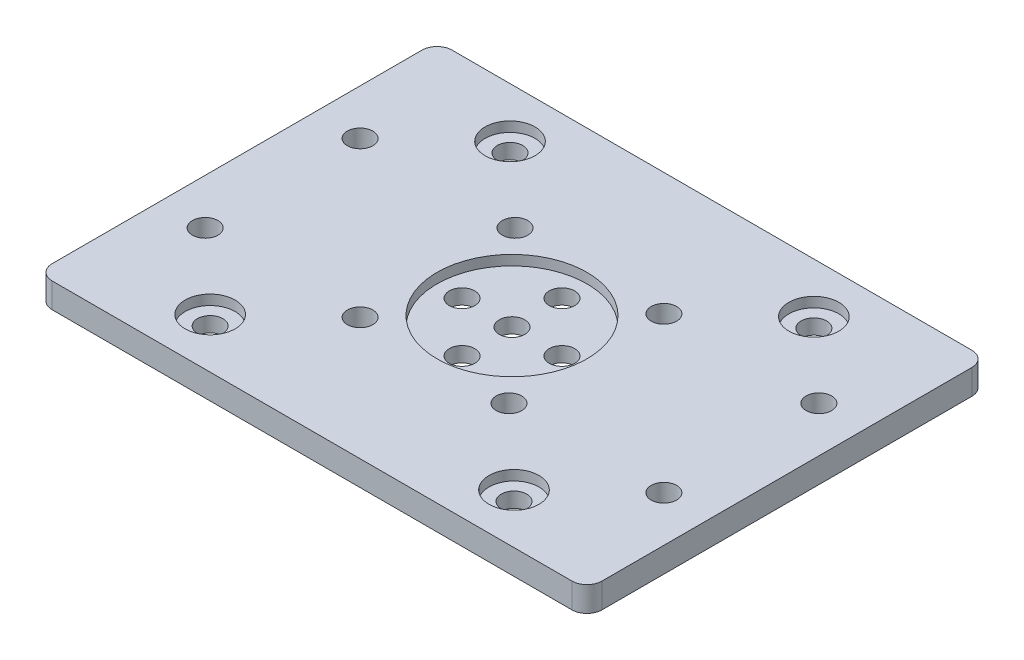
ISO-10303-21;
HEADER;
FILE_DESCRIPTION(('STEP AP214'),'2;1');
FILE_NAME('part.step','',(''),(''),'','','');
FILE_SCHEMA(('AUTOMOTIVE_DESIGN { 1 0 10303 214 1 1 1 1 }'));
ENDSEC;
DATA;
#1=APPLICATION_CONTEXT('core data for automotive mechanical design processes');
#2=APPLICATION_PROTOCOL_DEFINITION('international standard','automotive_design',2000,#1);
#3=PRODUCT_CONTEXT('',#1,'mechanical');
#4=PRODUCT('Part','Part','',(#3));
#5=PRODUCT_RELATED_PRODUCT_CATEGORY('part','',(#4));
#6=PRODUCT_DEFINITION_FORMATION('','',#4);
#7=PRODUCT_DEFINITION_CONTEXT('part definition',#1,'design');
#8=PRODUCT_DEFINITION('design','',#6,#7);
#9=PRODUCT_DEFINITION_SHAPE('','',#8);
#10=(LENGTH_UNIT() NAMED_UNIT(*) SI_UNIT(.MILLI.,.METRE.));
#11=(NAMED_UNIT(*) PLANE_ANGLE_UNIT() SI_UNIT($,.RADIAN.));
#12=(NAMED_UNIT(*) SI_UNIT($,.STERADIAN.) SOLID_ANGLE_UNIT());
#13=UNCERTAINTY_MEASURE_WITH_UNIT(LENGTH_MEASURE(1.E-05),#10,'distance_accuracy_value','');
#14=(GEOMETRIC_REPRESENTATION_CONTEXT(3) GLOBAL_UNCERTAINTY_ASSIGNED_CONTEXT((#13)) GLOBAL_UNIT_ASSIGNED_CONTEXT((#10,
#11,#12)) REPRESENTATION_CONTEXT('',''));
#15=CARTESIAN_POINT('',(0.,0.,0.));
#16=DIRECTION('',(0.,0.,1.));
#17=DIRECTION('',(1.,0.,0.));
#18=AXIS2_PLACEMENT_3D('',#15,#16,#17);
#19=CARTESIAN_POINT('',(0.,5.,0.));
#20=DIRECTION('',(0.,-1.,0.));
#21=DIRECTION('',(0.,0.,-1.));
#22=AXIS2_PLACEMENT_3D('',#19,#20,#21);
#23=CYLINDRICAL_SURFACE('',#22,2.55);
#24=CARTESIAN_POINT('',(0.,0.,0.));
#25=DIRECTION('',(0.,1.,0.));
#26=DIRECTION('',(0.,0.,1.));
#27=AXIS2_PLACEMENT_3D('',#24,#25,#26);
#28=CIRCLE('',#27,2.55);
#29=CARTESIAN_POINT('',(0.,0.,2.55));
#30=VERTEX_POINT('',#29);
#31=EDGE_CURVE('E137',#30,#30,#28,.T.);
#32=ORIENTED_EDGE('',*,*,#31,.F.);
#33=EDGE_LOOP('',(#32));
#34=FACE_BOUND('',#33,.T.);
#35=CARTESIAN_POINT('',(0.,3.,0.));
#36=DIRECTION('',(0.,1.,0.));
#37=DIRECTION('',(0.,0.,1.));
#38=AXIS2_PLACEMENT_3D('',#35,#36,#37);
#39=CIRCLE('',#38,2.55);
#40=CARTESIAN_POINT('',(0.,3.,2.55));
#41=VERTEX_POINT('',#40);
#42=EDGE_CURVE('E188',#41,#41,#39,.T.);
#43=ORIENTED_EDGE('',*,*,#42,.T.);
#44=EDGE_LOOP('',(#43));
#45=FACE_BOUND('',#44,.T.);
#46=ADVANCED_FACE('F33',(#34,#45),#23,.F.);
#47=CARTESIAN_POINT('',(0.,5.,-10.));
#48=DIRECTION('',(0.,-1.,0.));
#49=DIRECTION('',(0.,0.,-1.));
#50=AXIS2_PLACEMENT_3D('',#47,#48,#49);
#51=CYLINDRICAL_SURFACE('',#50,2.55);
#52=CARTESIAN_POINT('',(0.,0.,-10.));
#53=DIRECTION('',(0.,1.,0.));
#54=DIRECTION('',(0.,0.,1.));
#55=AXIS2_PLACEMENT_3D('',#52,#53,#54);
#56=CIRCLE('',#55,2.55);
#57=CARTESIAN_POINT('',(0.,0.,-7.45));
#58=VERTEX_POINT('',#57);
#59=EDGE_CURVE('E271',#58,#58,#56,.T.);
#60=ORIENTED_EDGE('',*,*,#59,.F.);
#61=EDGE_LOOP('',(#60));
#62=FACE_BOUND('',#61,.T.);
#63=CARTESIAN_POINT('',(0.,3.,-10.));
#64=DIRECTION('',(0.,1.,0.));
#65=DIRECTION('',(0.,0.,1.));
#66=AXIS2_PLACEMENT_3D('',#63,#64,#65);
#67=CIRCLE('',#66,2.55);
#68=CARTESIAN_POINT('',(0.,3.,-7.45));
#69=VERTEX_POINT('',#68);
#70=EDGE_CURVE('E353',#69,#69,#67,.T.);
#71=ORIENTED_EDGE('',*,*,#70,.T.);
#72=EDGE_LOOP('',(#71));
#73=FACE_BOUND('',#72,.T.);
#74=ADVANCED_FACE('F313',(#62,#73),#51,.F.);
#75=CARTESIAN_POINT('',(10.,5.,0.));
#76=DIRECTION('',(0.,-1.,0.));
#77=DIRECTION('',(0.,0.,-1.));
#78=AXIS2_PLACEMENT_3D('',#75,#76,#77);
#79=CYLINDRICAL_SURFACE('',#78,2.55);
#80=CARTESIAN_POINT('',(10.,0.,0.));
#81=DIRECTION('',(0.,1.,0.));
#82=DIRECTION('',(0.,0.,1.));
#83=AXIS2_PLACEMENT_3D('',#80,#81,#82);
#84=CIRCLE('',#83,2.55);
#85=CARTESIAN_POINT('',(10.,0.,2.55));
#86=VERTEX_POINT('',#85);
#87=EDGE_CURVE('E268',#86,#86,#84,.T.);
#88=ORIENTED_EDGE('',*,*,#87,.F.);
#89=EDGE_LOOP('',(#88));
#90=FACE_BOUND('',#89,.T.);
#91=CARTESIAN_POINT('',(10.,3.,0.));
#92=DIRECTION('',(0.,1.,0.));
#93=DIRECTION('',(0.,0.,1.));
#94=AXIS2_PLACEMENT_3D('',#91,#92,#93);
#95=CIRCLE('',#94,2.55);
#96=CARTESIAN_POINT('',(10.,3.,2.55));
#97=VERTEX_POINT('',#96);
#98=EDGE_CURVE('E355',#97,#97,#95,.T.);
#99=ORIENTED_EDGE('',*,*,#98,.T.);
#100=EDGE_LOOP('',(#99));
#101=FACE_BOUND('',#100,.T.);
#102=ADVANCED_FACE('F319',(#90,#101),#79,.F.);
#103=CARTESIAN_POINT('',(-9.99999999999999,5.,0.));
#104=DIRECTION('',(0.,-1.,0.));
#105=DIRECTION('',(0.,0.,-1.));
#106=AXIS2_PLACEMENT_3D('',#103,#104,#105);
#107=CYLINDRICAL_SURFACE('',#106,2.55);
#108=CARTESIAN_POINT('',(-9.99999999999999,0.,0.));
#109=DIRECTION('',(0.,1.,0.));
#110=DIRECTION('',(0.,0.,-1.));
#111=AXIS2_PLACEMENT_3D('',#108,#109,#110);
#112=CIRCLE('',#111,2.55);
#113=CARTESIAN_POINT('',(-9.99999999999999,0.,-2.55));
#114=VERTEX_POINT('',#113);
#115=EDGE_CURVE('E263',#114,#114,#112,.T.);
#116=ORIENTED_EDGE('',*,*,#115,.F.);
#117=EDGE_LOOP('',(#116));
#118=FACE_BOUND('',#117,.T.);
#119=CARTESIAN_POINT('',(-9.99999999999999,3.,0.));
#120=DIRECTION('',(0.,1.,0.));
#121=DIRECTION('',(0.,0.,1.));
#122=AXIS2_PLACEMENT_3D('',#119,#120,#121);
#123=CIRCLE('',#122,2.55);
#124=CARTESIAN_POINT('',(-9.99999999999999,3.,2.55));
#125=VERTEX_POINT('',#124);
#126=EDGE_CURVE('E358',#125,#125,#123,.T.);
#127=ORIENTED_EDGE('',*,*,#126,.T.);
#128=EDGE_LOOP('',(#127));
#129=FACE_BOUND('',#128,.T.);
#130=ADVANCED_FACE('F454',(#118,#129),#107,.F.);
#131=CARTESIAN_POINT('',(0.,5.,10.));
#132=DIRECTION('',(0.,-1.,0.));
#133=DIRECTION('',(0.,0.,-1.));
#134=AXIS2_PLACEMENT_3D('',#131,#132,#133);
#135=CYLINDRICAL_SURFACE('',#134,2.55);
#136=CARTESIAN_POINT('',(0.,0.,10.));
#137=DIRECTION('',(0.,1.,0.));
#138=DIRECTION('',(0.,0.,-1.));
#139=AXIS2_PLACEMENT_3D('',#136,#137,#138);
#140=CIRCLE('',#139,2.55);
#141=CARTESIAN_POINT('',(0.,0.,7.45));
#142=VERTEX_POINT('',#141);
#143=EDGE_CURVE('E242',#142,#142,#140,.T.);
#144=ORIENTED_EDGE('',*,*,#143,.F.);
#145=EDGE_LOOP('',(#144));
#146=FACE_BOUND('',#145,.T.);
#147=CARTESIAN_POINT('',(0.,3.,10.));
#148=DIRECTION('',(0.,1.,0.));
#149=DIRECTION('',(0.,0.,1.));
#150=AXIS2_PLACEMENT_3D('',#147,#148,#149);
#151=CIRCLE('',#150,2.55);
#152=CARTESIAN_POINT('',(0.,3.,12.55));
#153=VERTEX_POINT('',#152);
#154=EDGE_CURVE('E37',#153,#153,#151,.T.);
#155=ORIENTED_EDGE('',*,*,#154,.T.);
#156=EDGE_LOOP('',(#155));
#157=FACE_BOUND('',#156,.T.);
#158=ADVANCED_FACE('F373',(#146,#157),#135,.F.);
#159=CARTESIAN_POINT('',(30.4,5.,-30.));
#160=DIRECTION('',(0.,-1.,0.));
#161=DIRECTION('',(0.,0.,-1.));
#162=AXIS2_PLACEMENT_3D('',#159,#160,#161);
#163=CYLINDRICAL_SURFACE('',#162,2.54999999999999);
#164=CARTESIAN_POINT('',(30.4,0.,-30.));
#165=DIRECTION('',(0.,1.,0.));
#166=DIRECTION('',(0.,0.,1.));
#167=AXIS2_PLACEMENT_3D('',#164,#165,#166);
#168=CIRCLE('',#167,2.54999999999999);
#169=CARTESIAN_POINT('',(30.4,0.,-27.45));
#170=VERTEX_POINT('',#169);
#171=EDGE_CURVE('E247',#170,#170,#168,.T.);
#172=ORIENTED_EDGE('',*,*,#171,.F.);
#173=EDGE_LOOP('',(#172));
#174=FACE_BOUND('',#173,.T.);
#175=CARTESIAN_POINT('',(30.4,3.,-30.));
#176=DIRECTION('',(0.,1.,0.));
#177=DIRECTION('',(0.,0.,1.));
#178=AXIS2_PLACEMENT_3D('',#175,#176,#177);
#179=CIRCLE('',#178,2.54999999999999);
#180=CARTESIAN_POINT('',(30.4,3.,-27.45));
#181=VERTEX_POINT('',#180);
#182=EDGE_CURVE('E174',#181,#181,#179,.T.);
#183=ORIENTED_EDGE('',*,*,#182,.T.);
#184=EDGE_LOOP('',(#183));
#185=FACE_BOUND('',#184,.T.);
#186=ADVANCED_FACE('F443',(#174,#185),#163,.F.);
#187=CARTESIAN_POINT('',(30.4,5.,30.));
#188=DIRECTION('',(0.,-1.,0.));
#189=DIRECTION('',(0.,0.,-1.));
#190=AXIS2_PLACEMENT_3D('',#187,#188,#189);
#191=CYLINDRICAL_SURFACE('',#190,2.55);
#192=CARTESIAN_POINT('',(30.4,0.,30.));
#193=DIRECTION('',(0.,1.,0.));
#194=DIRECTION('',(0.,0.,-1.));
#195=AXIS2_PLACEMENT_3D('',#192,#193,#194);
#196=CIRCLE('',#195,2.55);
#197=CARTESIAN_POINT('',(30.4,0.,27.45));
#198=VERTEX_POINT('',#197);
#199=EDGE_CURVE('E227',#198,#198,#196,.T.);
#200=ORIENTED_EDGE('',*,*,#199,.F.);
#201=EDGE_LOOP('',(#200));
#202=FACE_BOUND('',#201,.T.);
#203=CARTESIAN_POINT('',(30.4,3.,30.));
#204=DIRECTION('',(0.,1.,0.));
#205=DIRECTION('',(0.,0.,1.));
#206=AXIS2_PLACEMENT_3D('',#203,#204,#205);
#207=CIRCLE('',#206,2.55);
#208=CARTESIAN_POINT('',(30.4,3.,32.55));
#209=VERTEX_POINT('',#208);
#210=EDGE_CURVE('E170',#209,#209,#207,.T.);
#211=ORIENTED_EDGE('',*,*,#210,.T.);
#212=EDGE_LOOP('',(#211));
#213=FACE_BOUND('',#212,.T.);
#214=ADVANCED_FACE('F440',(#202,#213),#191,.F.);
#215=CARTESIAN_POINT('',(-30.395,5.,-30.));
#216=DIRECTION('',(0.,-1.,0.));
#217=DIRECTION('',(0.,0.,-1.));
#218=AXIS2_PLACEMENT_3D('',#215,#216,#217);
#219=CYLINDRICAL_SURFACE('',#218,2.55);
#220=CARTESIAN_POINT('',(-30.395,0.,-30.));
#221=DIRECTION('',(0.,1.,0.));
#222=DIRECTION('',(0.,0.,1.));
#223=AXIS2_PLACEMENT_3D('',#220,#221,#222);
#224=CIRCLE('',#223,2.55);
#225=CARTESIAN_POINT('',(-30.395,0.,-27.45));
#226=VERTEX_POINT('',#225);
#227=EDGE_CURVE('E254',#226,#226,#224,.T.);
#228=ORIENTED_EDGE('',*,*,#227,.F.);
#229=EDGE_LOOP('',(#228));
#230=FACE_BOUND('',#229,.T.);
#231=CARTESIAN_POINT('',(-30.395,3.,-30.));
#232=DIRECTION('',(0.,1.,0.));
#233=DIRECTION('',(0.,0.,1.));
#234=AXIS2_PLACEMENT_3D('',#231,#232,#233);
#235=CIRCLE('',#234,2.55);
#236=CARTESIAN_POINT('',(-30.395,3.,-27.45));
#237=VERTEX_POINT('',#236);
#238=EDGE_CURVE('E165',#237,#237,#235,.T.);
#239=ORIENTED_EDGE('',*,*,#238,.T.);
#240=EDGE_LOOP('',(#239));
#241=FACE_BOUND('',#240,.T.);
#242=ADVANCED_FACE('F422',(#230,#241),#219,.F.);
#243=CARTESIAN_POINT('',(-30.395,5.,30.));
#244=DIRECTION('',(0.,-1.,0.));
#245=DIRECTION('',(0.,0.,-1.));
#246=AXIS2_PLACEMENT_3D('',#243,#244,#245);
#247=CYLINDRICAL_SURFACE('',#246,2.55);
#248=CARTESIAN_POINT('',(-30.395,0.,30.));
#249=DIRECTION('',(0.,1.,0.));
#250=DIRECTION('',(0.,0.,-1.));
#251=AXIS2_PLACEMENT_3D('',#248,#249,#250);
#252=CIRCLE('',#251,2.55);
#253=CARTESIAN_POINT('',(-30.395,0.,27.45));
#254=VERTEX_POINT('',#253);
#255=EDGE_CURVE('E163',#254,#254,#252,.T.);
#256=ORIENTED_EDGE('',*,*,#255,.F.);
#257=EDGE_LOOP('',(#256));
#258=FACE_BOUND('',#257,.T.);
#259=CARTESIAN_POINT('',(-30.395,3.,30.));
#260=DIRECTION('',(0.,1.,0.));
#261=DIRECTION('',(0.,0.,1.));
#262=AXIS2_PLACEMENT_3D('',#259,#260,#261);
#263=CIRCLE('',#262,2.55);
#264=CARTESIAN_POINT('',(-30.395,3.,32.55));
#265=VERTEX_POINT('',#264);
#266=EDGE_CURVE('E160',#265,#265,#263,.T.);
#267=ORIENTED_EDGE('',*,*,#266,.T.);
#268=EDGE_LOOP('',(#267));
#269=FACE_BOUND('',#268,.T.);
#270=ADVANCED_FACE('F327',(#258,#269),#247,.F.);
#271=CARTESIAN_POINT('',(-52.,5.,37.));
#272=DIRECTION('',(0.,-1.,0.));
#273=DIRECTION('',(0.,0.,-1.));
#274=AXIS2_PLACEMENT_3D('',#271,#272,#273);
#275=PLANE('',#274);
#276=CARTESIAN_POINT('',(0.,5.,0.));
#277=DIRECTION('',(0.,1.,0.));
#278=DIRECTION('',(0.,0.,1.));
#279=AXIS2_PLACEMENT_3D('',#276,#277,#278);
#280=CIRCLE('',#279,15.);
#281=CARTESIAN_POINT('',(0.,5.,15.));
#282=VERTEX_POINT('',#281);
#283=EDGE_CURVE('E363',#282,#282,#280,.T.);
#284=ORIENTED_EDGE('',*,*,#283,.F.);
#285=EDGE_LOOP('',(#284));
#286=FACE_BOUND('',#285,.T.);
#287=CARTESIAN_POINT('',(30.4,5.,-30.));
#288=DIRECTION('',(0.,1.,0.));
#289=DIRECTION('',(0.,0.,1.));
#290=AXIS2_PLACEMENT_3D('',#287,#288,#289);
#291=CIRCLE('',#290,4.99999999999999);
#292=CARTESIAN_POINT('',(30.4,5.,-25.));
#293=VERTEX_POINT('',#292);
#294=EDGE_CURVE('E183',#293,#293,#291,.T.);
#295=ORIENTED_EDGE('',*,*,#294,.F.);
#296=EDGE_LOOP('',(#295));
#297=FACE_BOUND('',#296,.T.);
#298=CARTESIAN_POINT('',(30.4,5.,30.));
#299=DIRECTION('',(0.,1.,0.));
#300=DIRECTION('',(0.,0.,1.));
#301=AXIS2_PLACEMENT_3D('',#298,#299,#300);
#302=CIRCLE('',#301,5.);
#303=CARTESIAN_POINT('',(30.4,5.,35.));
#304=VERTEX_POINT('',#303);
#305=EDGE_CURVE('E176',#304,#304,#302,.T.);
#306=ORIENTED_EDGE('',*,*,#305,.F.);
#307=EDGE_LOOP('',(#306));
#308=FACE_BOUND('',#307,.T.);
#309=CARTESIAN_POINT('',(-30.395,5.,-30.));
#310=DIRECTION('',(0.,1.,0.));
#311=DIRECTION('',(0.,0.,1.));
#312=AXIS2_PLACEMENT_3D('',#309,#310,#311);
#313=CIRCLE('',#312,5.);
#314=CARTESIAN_POINT('',(-30.395,5.,-25.));
#315=VERTEX_POINT('',#314);
#316=EDGE_CURVE('E172',#315,#315,#313,.T.);
#317=ORIENTED_EDGE('',*,*,#316,.F.);
#318=EDGE_LOOP('',(#317));
#319=FACE_BOUND('',#318,.T.);
#320=CARTESIAN_POINT('',(-30.395,5.,30.));
#321=DIRECTION('',(0.,1.,0.));
#322=DIRECTION('',(0.,0.,1.));
#323=AXIS2_PLACEMENT_3D('',#320,#321,#322);
#324=CIRCLE('',#323,5.);
#325=CARTESIAN_POINT('',(-30.395,5.,35.));
#326=VERTEX_POINT('',#325);
#327=EDGE_CURVE('E168',#326,#326,#324,.T.);
#328=ORIENTED_EDGE('',*,*,#327,.F.);
#329=EDGE_LOOP('',(#328));
#330=FACE_BOUND('',#329,.T.);
#331=CARTESIAN_POINT('',(-45.895,5.,15.5));
#332=DIRECTION('',(0.,1.,0.));
#333=DIRECTION('',(0.,0.,-1.));
#334=AXIS2_PLACEMENT_3D('',#331,#332,#333);
#335=CIRCLE('',#334,2.55);
#336=CARTESIAN_POINT('',(-45.895,5.,12.95));
#337=VERTEX_POINT('',#336);
#338=EDGE_CURVE('E206',#337,#337,#335,.T.);
#339=ORIENTED_EDGE('',*,*,#338,.F.);
#340=EDGE_LOOP('',(#339));
#341=FACE_BOUND('',#340,.T.);
#342=CARTESIAN_POINT('',(14.895,5.,15.5));
#343=DIRECTION('',(0.,1.,0.));
#344=DIRECTION('',(0.,0.,1.));
#345=AXIS2_PLACEMENT_3D('',#342,#343,#344);
#346=CIRCLE('',#345,2.55);
#347=CARTESIAN_POINT('',(14.895,5.,18.05));
#348=VERTEX_POINT('',#347);
#349=EDGE_CURVE('E218',#348,#348,#346,.T.);
#350=ORIENTED_EDGE('',*,*,#349,.F.);
#351=EDGE_LOOP('',(#350));
#352=FACE_BOUND('',#351,.T.);
#353=CARTESIAN_POINT('',(14.895,5.,-15.5));
#354=DIRECTION('',(0.,1.,0.));
#355=DIRECTION('',(0.,0.,-1.));
#356=AXIS2_PLACEMENT_3D('',#353,#354,#355);
#357=CIRCLE('',#356,2.55);
#358=CARTESIAN_POINT('',(14.895,5.,-18.05));
#359=VERTEX_POINT('',#358);
#360=EDGE_CURVE('E239',#359,#359,#357,.T.);
#361=ORIENTED_EDGE('',*,*,#360,.F.);
#362=EDGE_LOOP('',(#361));
#363=FACE_BOUND('',#362,.T.);
#364=CARTESIAN_POINT('',(-52.,5.,37.));
#365=DIRECTION('',(0.,1.,0.));
#366=DIRECTION('',(0.,0.,-1.));
#367=AXIS2_PLACEMENT_3D('',#364,#365,#366);
#368=CIRCLE('',#367,3.00000000000001);
#369=CARTESIAN_POINT('',(-55.,5.,37.));
#370=VERTEX_POINT('',#369);
#371=CARTESIAN_POINT('',(-52.,5.,40.));
#372=VERTEX_POINT('',#371);
#373=EDGE_CURVE('E148',#370,#372,#368,.T.);
#374=ORIENTED_EDGE('',*,*,#373,.T.);
#375=DIRECTION('',(1.,0.,0.));
#376=VECTOR('',#375,1.);
#377=CARTESIAN_POINT('',(52.,5.,40.));
#378=LINE('',#377,#376);
#379=CARTESIAN_POINT('',(52.,5.,40.));
#380=VERTEX_POINT('',#379);
#381=EDGE_CURVE('E95',#372,#380,#378,.T.);
#382=ORIENTED_EDGE('',*,*,#381,.T.);
#383=CARTESIAN_POINT('',(52.,5.,37.));
#384=DIRECTION('',(0.,1.,0.));
#385=DIRECTION('',(0.,0.,1.));
#386=AXIS2_PLACEMENT_3D('',#383,#384,#385);
#387=CIRCLE('',#386,3.00000000000002);
#388=CARTESIAN_POINT('',(55.,5.,37.));
#389=VERTEX_POINT('',#388);
#390=EDGE_CURVE('E278',#380,#389,#387,.T.);
#391=ORIENTED_EDGE('',*,*,#390,.T.);
#392=DIRECTION('',(0.,0.,-1.));
#393=VECTOR('',#392,1.);
#394=CARTESIAN_POINT('',(55.,5.,37.));
#395=LINE('',#394,#393);
#396=CARTESIAN_POINT('',(55.,5.,-37.));
#397=VERTEX_POINT('',#396);
#398=EDGE_CURVE('E280',#389,#397,#395,.T.);
#399=ORIENTED_EDGE('',*,*,#398,.T.);
#400=CARTESIAN_POINT('',(52.,5.,-37.));
#401=DIRECTION('',(0.,1.,0.));
#402=DIRECTION('',(0.,0.,1.));
#403=AXIS2_PLACEMENT_3D('',#400,#401,#402);
#404=CIRCLE('',#403,3.00000000000002);
#405=CARTESIAN_POINT('',(52.,5.,-40.));
#406=VERTEX_POINT('',#405);
#407=EDGE_CURVE('E115',#397,#406,#404,.T.);
#408=ORIENTED_EDGE('',*,*,#407,.T.);
#409=DIRECTION('',(-1.,0.,0.));
#410=VECTOR('',#409,1.);
#411=CARTESIAN_POINT('',(52.,5.,-40.));
#412=LINE('',#411,#410);
#413=CARTESIAN_POINT('',(-52.,5.,-40.));
#414=VERTEX_POINT('',#413);
#415=EDGE_CURVE('E108',#406,#414,#412,.T.);
#416=ORIENTED_EDGE('',*,*,#415,.T.);
#417=CARTESIAN_POINT('',(-52.,5.,-37.));
#418=DIRECTION('',(0.,1.,0.));
#419=DIRECTION('',(0.,0.,1.));
#420=AXIS2_PLACEMENT_3D('',#417,#418,#419);
#421=CIRCLE('',#420,3.00000000000002);
#422=CARTESIAN_POINT('',(-55.,5.,-37.));
#423=VERTEX_POINT('',#422);
#424=EDGE_CURVE('E113',#414,#423,#421,.T.);
#425=ORIENTED_EDGE('',*,*,#424,.T.);
#426=DIRECTION('',(0.,0.,1.));
#427=VECTOR('',#426,1.);
#428=CARTESIAN_POINT('',(-55.,5.,37.));
#429=LINE('',#428,#427);
#430=EDGE_CURVE('E52',#423,#370,#429,.T.);
#431=ORIENTED_EDGE('',*,*,#430,.T.);
#432=EDGE_LOOP('',(#374,#382,#391,#399,#408,#416,#425,#431));
#433=FACE_BOUND('',#432,.T.);
#434=CARTESIAN_POINT('',(-45.895,5.,-15.5));
#435=DIRECTION('',(0.,1.,0.));
#436=DIRECTION('',(0.,0.,1.));
#437=AXIS2_PLACEMENT_3D('',#434,#435,#436);
#438=CIRCLE('',#437,2.55);
#439=CARTESIAN_POINT('',(-45.895,5.,-12.95));
#440=VERTEX_POINT('',#439);
#441=EDGE_CURVE('E260',#440,#440,#438,.T.);
#442=ORIENTED_EDGE('',*,*,#441,.F.);
#443=EDGE_LOOP('',(#442));
#444=FACE_BOUND('',#443,.T.);
#445=CARTESIAN_POINT('',(-14.895,5.,-15.5));
#446=DIRECTION('',(0.,1.,0.));
#447=DIRECTION('',(0.,0.,1.));
#448=AXIS2_PLACEMENT_3D('',#445,#446,#447);
#449=CIRCLE('',#448,2.55);
#450=CARTESIAN_POINT('',(-14.895,5.,-12.95));
#451=VERTEX_POINT('',#450);
#452=EDGE_CURVE('E251',#451,#451,#449,.T.);
#453=ORIENTED_EDGE('',*,*,#452,.F.);
#454=EDGE_LOOP('',(#453));
#455=FACE_BOUND('',#454,.T.);
#456=CARTESIAN_POINT('',(45.895,5.,-15.5));
#457=DIRECTION('',(0.,1.,0.));
#458=DIRECTION('',(0.,0.,-1.));
#459=AXIS2_PLACEMENT_3D('',#456,#457,#458);
#460=CIRCLE('',#459,2.55000000000001);
#461=CARTESIAN_POINT('',(45.895,5.,-18.05));
#462=VERTEX_POINT('',#461);
#463=EDGE_CURVE('E233',#462,#462,#460,.T.);
#464=ORIENTED_EDGE('',*,*,#463,.F.);
#465=EDGE_LOOP('',(#464));
#466=FACE_BOUND('',#465,.T.);
#467=CARTESIAN_POINT('',(45.895,5.,15.5));
#468=DIRECTION('',(0.,1.,0.));
#469=DIRECTION('',(0.,0.,1.));
#470=AXIS2_PLACEMENT_3D('',#467,#468,#469);
#471=CIRCLE('',#470,2.55000000000001);
#472=CARTESIAN_POINT('',(45.895,5.,18.05));
#473=VERTEX_POINT('',#472);
#474=EDGE_CURVE('E224',#473,#473,#471,.T.);
#475=ORIENTED_EDGE('',*,*,#474,.F.);
#476=EDGE_LOOP('',(#475));
#477=FACE_BOUND('',#476,.T.);
#478=CARTESIAN_POINT('',(-14.895,5.,15.5));
#479=DIRECTION('',(0.,1.,0.));
#480=DIRECTION('',(0.,0.,-1.));
#481=AXIS2_PLACEMENT_3D('',#478,#479,#480);
#482=CIRCLE('',#481,2.55);
#483=CARTESIAN_POINT('',(-14.895,5.,12.95));
#484=VERTEX_POINT('',#483);
#485=EDGE_CURVE('E212',#484,#484,#482,.T.);
#486=ORIENTED_EDGE('',*,*,#485,.F.);
#487=EDGE_LOOP('',(#486));
#488=FACE_BOUND('',#487,.T.);
#489=ADVANCED_FACE('F110',(#286,#297,#308,#319,#330,#341,#352,#363,#433,#444,#455,#466,#477,
#488),#275,.F.);
#490=CARTESIAN_POINT('',(-52.,0.,37.));
#491=DIRECTION('',(0.,-1.,0.));
#492=DIRECTION('',(0.,0.,-1.));
#493=AXIS2_PLACEMENT_3D('',#490,#491,#492);
#494=PLANE('',#493);
#495=CARTESIAN_POINT('',(-45.895,0.,15.5));
#496=DIRECTION('',(0.,1.,0.));
#497=DIRECTION('',(0.,0.,-1.));
#498=AXIS2_PLACEMENT_3D('',#495,#496,#497);
#499=CIRCLE('',#498,2.55);
#500=CARTESIAN_POINT('',(-45.895,0.,12.95));
#501=VERTEX_POINT('',#500);
#502=EDGE_CURVE('E205',#501,#501,#499,.T.);
#503=ORIENTED_EDGE('',*,*,#502,.T.);
#504=EDGE_LOOP('',(#503));
#505=FACE_BOUND('',#504,.T.);
#506=CARTESIAN_POINT('',(14.895,0.,15.5));
#507=DIRECTION('',(0.,1.,0.));
#508=DIRECTION('',(0.,0.,1.));
#509=AXIS2_PLACEMENT_3D('',#506,#507,#508);
#510=CIRCLE('',#509,2.55);
#511=CARTESIAN_POINT('',(14.895,0.,18.05));
#512=VERTEX_POINT('',#511);
#513=EDGE_CURVE('E215',#512,#512,#510,.T.);
#514=ORIENTED_EDGE('',*,*,#513,.T.);
#515=EDGE_LOOP('',(#514));
#516=FACE_BOUND('',#515,.T.);
#517=ORIENTED_EDGE('',*,*,#199,.T.);
#518=EDGE_LOOP('',(#517));
#519=FACE_BOUND('',#518,.T.);
#520=CARTESIAN_POINT('',(14.895,0.,-15.5));
#521=DIRECTION('',(0.,1.,0.));
#522=DIRECTION('',(0.,0.,-1.));
#523=AXIS2_PLACEMENT_3D('',#520,#521,#522);
#524=CIRCLE('',#523,2.55);
#525=CARTESIAN_POINT('',(14.895,0.,-18.05));
#526=VERTEX_POINT('',#525);
#527=EDGE_CURVE('E236',#526,#526,#524,.T.);
#528=ORIENTED_EDGE('',*,*,#527,.T.);
#529=EDGE_LOOP('',(#528));
#530=FACE_BOUND('',#529,.T.);
#531=ORIENTED_EDGE('',*,*,#171,.T.);
#532=EDGE_LOOP('',(#531));
#533=FACE_BOUND('',#532,.T.);
#534=ORIENTED_EDGE('',*,*,#227,.T.);
#535=EDGE_LOOP('',(#534));
#536=FACE_BOUND('',#535,.T.);
#537=ORIENTED_EDGE('',*,*,#115,.T.);
#538=EDGE_LOOP('',(#537));
#539=FACE_BOUND('',#538,.T.);
#540=ORIENTED_EDGE('',*,*,#59,.T.);
#541=EDGE_LOOP('',(#540));
#542=FACE_BOUND('',#541,.T.);
#543=CARTESIAN_POINT('',(-52.,0.,37.));
#544=DIRECTION('',(0.,1.,0.));
#545=DIRECTION('',(0.,0.,-1.));
#546=AXIS2_PLACEMENT_3D('',#543,#544,#545);
#547=CIRCLE('',#546,3.00000000000001);
#548=CARTESIAN_POINT('',(-55.,0.,37.));
#549=VERTEX_POINT('',#548);
#550=CARTESIAN_POINT('',(-52.,0.,40.));
#551=VERTEX_POINT('',#550);
#552=EDGE_CURVE('E133',#549,#551,#547,.T.);
#553=ORIENTED_EDGE('',*,*,#552,.F.);
#554=DIRECTION('',(0.,0.,1.));
#555=VECTOR('',#554,1.);
#556=CARTESIAN_POINT('',(-55.,0.,37.));
#557=LINE('',#556,#555);
#558=CARTESIAN_POINT('',(-55.,0.,-37.));
#559=VERTEX_POINT('',#558);
#560=EDGE_CURVE('E87',#559,#549,#557,.T.);
#561=ORIENTED_EDGE('',*,*,#560,.F.);
#562=CARTESIAN_POINT('',(-52.,0.,-37.));
#563=DIRECTION('',(0.,1.,0.));
#564=DIRECTION('',(0.,0.,1.));
#565=AXIS2_PLACEMENT_3D('',#562,#563,#564);
#566=CIRCLE('',#565,3.00000000000002);
#567=CARTESIAN_POINT('',(-52.,0.,-40.));
#568=VERTEX_POINT('',#567);
#569=EDGE_CURVE('E81',#568,#559,#566,.T.);
#570=ORIENTED_EDGE('',*,*,#569,.F.);
#571=DIRECTION('',(-1.,0.,0.));
#572=VECTOR('',#571,1.);
#573=CARTESIAN_POINT('',(52.,0.,-40.));
#574=LINE('',#573,#572);
#575=CARTESIAN_POINT('',(52.,0.,-40.));
#576=VERTEX_POINT('',#575);
#577=EDGE_CURVE('E123',#576,#568,#574,.T.);
#578=ORIENTED_EDGE('',*,*,#577,.F.);
#579=CARTESIAN_POINT('',(52.,0.,-37.));
#580=DIRECTION('',(0.,1.,0.));
#581=DIRECTION('',(0.,0.,1.));
#582=AXIS2_PLACEMENT_3D('',#579,#580,#581);
#583=CIRCLE('',#582,3.00000000000002);
#584=CARTESIAN_POINT('',(55.,0.,-37.));
#585=VERTEX_POINT('',#584);
#586=EDGE_CURVE('E143',#585,#576,#583,.T.);
#587=ORIENTED_EDGE('',*,*,#586,.F.);
#588=DIRECTION('',(0.,0.,-1.));
#589=VECTOR('',#588,1.);
#590=CARTESIAN_POINT('',(55.,0.,37.));
#591=LINE('',#590,#589);
#592=CARTESIAN_POINT('',(55.,0.,37.));
#593=VERTEX_POINT('',#592);
#594=EDGE_CURVE('E141',#593,#585,#591,.T.);
#595=ORIENTED_EDGE('',*,*,#594,.F.);
#596=CARTESIAN_POINT('',(52.,0.,37.));
#597=DIRECTION('',(0.,1.,0.));
#598=DIRECTION('',(0.,0.,1.));
#599=AXIS2_PLACEMENT_3D('',#596,#597,#598);
#600=CIRCLE('',#599,3.00000000000002);
#601=CARTESIAN_POINT('',(52.,0.,40.));
#602=VERTEX_POINT('',#601);
#603=EDGE_CURVE('E139',#602,#593,#600,.T.);
#604=ORIENTED_EDGE('',*,*,#603,.F.);
#605=DIRECTION('',(1.,0.,0.));
#606=VECTOR('',#605,1.);
#607=CARTESIAN_POINT('',(52.,0.,40.));
#608=LINE('',#607,#606);
#609=EDGE_CURVE('E136',#551,#602,#608,.T.);
#610=ORIENTED_EDGE('',*,*,#609,.F.);
#611=EDGE_LOOP('',(#553,#561,#570,#578,#587,#595,#604,#610));
#612=FACE_BOUND('',#611,.T.);
#613=ORIENTED_EDGE('',*,*,#31,.T.);
#614=EDGE_LOOP('',(#613));
#615=FACE_BOUND('',#614,.T.);
#616=ORIENTED_EDGE('',*,*,#87,.T.);
#617=EDGE_LOOP('',(#616));
#618=FACE_BOUND('',#617,.T.);
#619=CARTESIAN_POINT('',(-45.895,0.,-15.5));
#620=DIRECTION('',(0.,1.,0.));
#621=DIRECTION('',(0.,0.,1.));
#622=AXIS2_PLACEMENT_3D('',#619,#620,#621);
#623=CIRCLE('',#622,2.55);
#624=CARTESIAN_POINT('',(-45.895,0.,-12.95));
#625=VERTEX_POINT('',#624);
#626=EDGE_CURVE('E259',#625,#625,#623,.T.);
#627=ORIENTED_EDGE('',*,*,#626,.T.);
#628=EDGE_LOOP('',(#627));
#629=FACE_BOUND('',#628,.T.);
#630=CARTESIAN_POINT('',(-14.895,0.,-15.5));
#631=DIRECTION('',(0.,1.,0.));
#632=DIRECTION('',(0.,0.,1.));
#633=AXIS2_PLACEMENT_3D('',#630,#631,#632);
#634=CIRCLE('',#633,2.55);
#635=CARTESIAN_POINT('',(-14.895,0.,-12.95));
#636=VERTEX_POINT('',#635);
#637=EDGE_CURVE('E250',#636,#636,#634,.T.);
#638=ORIENTED_EDGE('',*,*,#637,.T.);
#639=EDGE_LOOP('',(#638));
#640=FACE_BOUND('',#639,.T.);
#641=ORIENTED_EDGE('',*,*,#143,.T.);
#642=EDGE_LOOP('',(#641));
#643=FACE_BOUND('',#642,.T.);
#644=CARTESIAN_POINT('',(45.895,0.,-15.5));
#645=DIRECTION('',(0.,1.,0.));
#646=DIRECTION('',(0.,0.,-1.));
#647=AXIS2_PLACEMENT_3D('',#644,#645,#646);
#648=CIRCLE('',#647,2.55000000000001);
#649=CARTESIAN_POINT('',(45.895,0.,-18.05));
#650=VERTEX_POINT('',#649);
#651=EDGE_CURVE('E232',#650,#650,#648,.T.);
#652=ORIENTED_EDGE('',*,*,#651,.T.);
#653=EDGE_LOOP('',(#652));
#654=FACE_BOUND('',#653,.T.);
#655=CARTESIAN_POINT('',(45.895,0.,15.5));
#656=DIRECTION('',(0.,1.,0.));
#657=DIRECTION('',(0.,0.,1.));
#658=AXIS2_PLACEMENT_3D('',#655,#656,#657);
#659=CIRCLE('',#658,2.55000000000001);
#660=CARTESIAN_POINT('',(45.895,0.,18.05));
#661=VERTEX_POINT('',#660);
#662=EDGE_CURVE('E221',#661,#661,#659,.T.);
#663=ORIENTED_EDGE('',*,*,#662,.T.);
#664=EDGE_LOOP('',(#663));
#665=FACE_BOUND('',#664,.T.);
#666=CARTESIAN_POINT('',(-14.895,0.,15.5));
#667=DIRECTION('',(0.,1.,0.));
#668=DIRECTION('',(0.,0.,-1.));
#669=AXIS2_PLACEMENT_3D('',#666,#667,#668);
#670=CIRCLE('',#669,2.55);
#671=CARTESIAN_POINT('',(-14.895,0.,12.95));
#672=VERTEX_POINT('',#671);
#673=EDGE_CURVE('E209',#672,#672,#670,.T.);
#674=ORIENTED_EDGE('',*,*,#673,.T.);
#675=EDGE_LOOP('',(#674));
#676=FACE_BOUND('',#675,.T.);
#677=ORIENTED_EDGE('',*,*,#255,.T.);
#678=EDGE_LOOP('',(#677));
#679=FACE_BOUND('',#678,.T.);
#680=ADVANCED_FACE('F293',(#505,#516,#519,#530,#533,#536,#539,#542,#612,#615,#618,#629,#640,
#643,#654,#665,#676,#679),#494,.T.);
#681=CARTESIAN_POINT('',(-52.,5.,37.));
#682=DIRECTION('',(0.,-1.,0.));
#683=DIRECTION('',(0.,0.,-1.));
#684=AXIS2_PLACEMENT_3D('',#681,#682,#683);
#685=CYLINDRICAL_SURFACE('',#684,3.00000000000001);
#686=ORIENTED_EDGE('',*,*,#552,.T.);
#687=DIRECTION('',(0.,-1.,0.));
#688=VECTOR('',#687,1.);
#689=CARTESIAN_POINT('',(-52.,5.,40.));
#690=LINE('',#689,#688);
#691=EDGE_CURVE('E11',#372,#551,#690,.T.);
#692=ORIENTED_EDGE('',*,*,#691,.F.);
#693=ORIENTED_EDGE('',*,*,#373,.F.);
#694=DIRECTION('',(0.,-1.,0.));
#695=VECTOR('',#694,1.);
#696=CARTESIAN_POINT('',(-55.,5.,37.));
#697=LINE('',#696,#695);
#698=EDGE_CURVE('E129',#370,#549,#697,.T.);
#699=ORIENTED_EDGE('',*,*,#698,.T.);
#700=EDGE_LOOP('',(#686,#692,#693,#699));
#701=FACE_BOUND('',#700,.T.);
#702=ADVANCED_FACE('F35',(#701),#685,.T.);
#703=CARTESIAN_POINT('',(52.,5.,40.));
#704=DIRECTION('',(0.,0.,-1.));
#705=DIRECTION('',(-1.,0.,0.));
#706=AXIS2_PLACEMENT_3D('',#703,#704,#705);
#707=PLANE('',#706);
#708=ORIENTED_EDGE('',*,*,#609,.T.);
#709=DIRECTION('',(0.,-1.,0.));
#710=VECTOR('',#709,1.);
#711=CARTESIAN_POINT('',(52.,5.,40.));
#712=LINE('',#711,#710);
#713=EDGE_CURVE('E43',#380,#602,#712,.T.);
#714=ORIENTED_EDGE('',*,*,#713,.F.);
#715=ORIENTED_EDGE('',*,*,#381,.F.);
#716=ORIENTED_EDGE('',*,*,#691,.T.);
#717=EDGE_LOOP('',(#708,#714,#715,#716));
#718=FACE_BOUND('',#717,.T.);
#719=ADVANCED_FACE('F334',(#718),#707,.F.);
#720=CARTESIAN_POINT('',(52.,5.,37.));
#721=DIRECTION('',(0.,-1.,0.));
#722=DIRECTION('',(0.,0.,-1.));
#723=AXIS2_PLACEMENT_3D('',#720,#721,#722);
#724=CYLINDRICAL_SURFACE('',#723,3.00000000000002);
#725=ORIENTED_EDGE('',*,*,#603,.T.);
#726=DIRECTION('',(0.,-1.,0.));
#727=VECTOR('',#726,1.);
#728=CARTESIAN_POINT('',(55.,5.,37.));
#729=LINE('',#728,#727);
#730=EDGE_CURVE('E155',#389,#593,#729,.T.);
#731=ORIENTED_EDGE('',*,*,#730,.F.);
#732=ORIENTED_EDGE('',*,*,#390,.F.);
#733=ORIENTED_EDGE('',*,*,#713,.T.);
#734=EDGE_LOOP('',(#725,#731,#732,#733));
#735=FACE_BOUND('',#734,.T.);
#736=ADVANCED_FACE('F673',(#735),#724,.T.);
#737=CARTESIAN_POINT('',(55.,5.,37.));
#738=DIRECTION('',(-1.,0.,0.));
#739=DIRECTION('',(0.,0.,1.));
#740=AXIS2_PLACEMENT_3D('',#737,#738,#739);
#741=PLANE('',#740);
#742=ORIENTED_EDGE('',*,*,#594,.T.);
#743=DIRECTION('',(0.,-1.,0.));
#744=VECTOR('',#743,1.);
#745=CARTESIAN_POINT('',(55.,5.,-37.));
#746=LINE('',#745,#744);
#747=EDGE_CURVE('E152',#397,#585,#746,.T.);
#748=ORIENTED_EDGE('',*,*,#747,.F.);
#749=ORIENTED_EDGE('',*,*,#398,.F.);
#750=ORIENTED_EDGE('',*,*,#730,.T.);
#751=EDGE_LOOP('',(#742,#748,#749,#750));
#752=FACE_BOUND('',#751,.T.);
#753=ADVANCED_FACE('F286',(#752),#741,.F.);
#754=CARTESIAN_POINT('',(52.,5.,-37.));
#755=DIRECTION('',(0.,-1.,0.));
#756=DIRECTION('',(0.,0.,-1.));
#757=AXIS2_PLACEMENT_3D('',#754,#755,#756);
#758=CYLINDRICAL_SURFACE('',#757,3.00000000000002);
#759=ORIENTED_EDGE('',*,*,#586,.T.);
#760=DIRECTION('',(0.,-1.,0.));
#761=VECTOR('',#760,1.);
#762=CARTESIAN_POINT('',(52.,5.,-40.));
#763=LINE('',#762,#761);
#764=EDGE_CURVE('E124',#406,#576,#763,.T.);
#765=ORIENTED_EDGE('',*,*,#764,.F.);
#766=ORIENTED_EDGE('',*,*,#407,.F.);
#767=ORIENTED_EDGE('',*,*,#747,.T.);
#768=EDGE_LOOP('',(#759,#765,#766,#767));
#769=FACE_BOUND('',#768,.T.);
#770=ADVANCED_FACE('F290',(#769),#758,.T.);
#771=CARTESIAN_POINT('',(52.,5.,-40.));
#772=DIRECTION('',(0.,0.,1.));
#773=DIRECTION('',(1.,0.,0.));
#774=AXIS2_PLACEMENT_3D('',#771,#772,#773);
#775=PLANE('',#774);
#776=ORIENTED_EDGE('',*,*,#577,.T.);
#777=DIRECTION('',(0.,-1.,0.));
#778=VECTOR('',#777,1.);
#779=CARTESIAN_POINT('',(-52.,5.,-40.));
#780=LINE('',#779,#778);
#781=EDGE_CURVE('E120',#414,#568,#780,.T.);
#782=ORIENTED_EDGE('',*,*,#781,.F.);
#783=ORIENTED_EDGE('',*,*,#415,.F.);
#784=ORIENTED_EDGE('',*,*,#764,.T.);
#785=EDGE_LOOP('',(#776,#782,#783,#784));
#786=FACE_BOUND('',#785,.T.);
#787=ADVANCED_FACE('F121',(#786),#775,.F.);
#788=CARTESIAN_POINT('',(-52.,5.,-37.));
#789=DIRECTION('',(0.,-1.,0.));
#790=DIRECTION('',(0.,0.,-1.));
#791=AXIS2_PLACEMENT_3D('',#788,#789,#790);
#792=CYLINDRICAL_SURFACE('',#791,3.00000000000002);
#793=ORIENTED_EDGE('',*,*,#569,.T.);
#794=DIRECTION('',(0.,-1.,0.));
#795=VECTOR('',#794,1.);
#796=CARTESIAN_POINT('',(-55.,5.,-37.));
#797=LINE('',#796,#795);
#798=EDGE_CURVE('E125',#423,#559,#797,.T.);
#799=ORIENTED_EDGE('',*,*,#798,.F.);
#800=ORIENTED_EDGE('',*,*,#424,.F.);
#801=ORIENTED_EDGE('',*,*,#781,.T.);
#802=EDGE_LOOP('',(#793,#799,#800,#801));
#803=FACE_BOUND('',#802,.T.);
#804=ADVANCED_FACE('F127',(#803),#792,.T.);
#805=CARTESIAN_POINT('',(-55.,5.,37.));
#806=DIRECTION('',(1.,0.,0.));
#807=DIRECTION('',(0.,0.,-1.));
#808=AXIS2_PLACEMENT_3D('',#805,#806,#807);
#809=PLANE('',#808);
#810=ORIENTED_EDGE('',*,*,#560,.T.);
#811=ORIENTED_EDGE('',*,*,#698,.F.);
#812=ORIENTED_EDGE('',*,*,#430,.F.);
#813=ORIENTED_EDGE('',*,*,#798,.T.);
#814=EDGE_LOOP('',(#810,#811,#812,#813));
#815=FACE_BOUND('',#814,.T.);
#816=ADVANCED_FACE('F299',(#815),#809,.F.);
#817=CARTESIAN_POINT('',(-45.895,5.,-15.5));
#818=DIRECTION('',(0.,-1.,0.));
#819=DIRECTION('',(0.,0.,-1.));
#820=AXIS2_PLACEMENT_3D('',#817,#818,#819);
#821=CYLINDRICAL_SURFACE('',#820,2.55);
#822=ORIENTED_EDGE('',*,*,#441,.T.);
#823=EDGE_LOOP('',(#822));
#824=FACE_BOUND('',#823,.T.);
#825=ORIENTED_EDGE('',*,*,#626,.F.);
#826=EDGE_LOOP('',(#825));
#827=FACE_BOUND('',#826,.T.);
#828=ADVANCED_FACE('F301',(#824,#827),#821,.F.);
#829=CARTESIAN_POINT('',(-14.895,5.,-15.5));
#830=DIRECTION('',(0.,-1.,0.));
#831=DIRECTION('',(0.,0.,-1.));
#832=AXIS2_PLACEMENT_3D('',#829,#830,#831);
#833=CYLINDRICAL_SURFACE('',#832,2.55);
#834=ORIENTED_EDGE('',*,*,#452,.T.);
#835=EDGE_LOOP('',(#834));
#836=FACE_BOUND('',#835,.T.);
#837=ORIENTED_EDGE('',*,*,#637,.F.);
#838=EDGE_LOOP('',(#837));
#839=FACE_BOUND('',#838,.T.);
#840=ADVANCED_FACE('F307',(#836,#839),#833,.F.);
#841=CARTESIAN_POINT('',(14.895,5.,-15.5));
#842=DIRECTION('',(0.,-1.,0.));
#843=DIRECTION('',(0.,0.,-1.));
#844=AXIS2_PLACEMENT_3D('',#841,#842,#843);
#845=CYLINDRICAL_SURFACE('',#844,2.55);
#846=ORIENTED_EDGE('',*,*,#360,.T.);
#847=EDGE_LOOP('',(#846));
#848=FACE_BOUND('',#847,.T.);
#849=ORIENTED_EDGE('',*,*,#527,.F.);
#850=EDGE_LOOP('',(#849));
#851=FACE_BOUND('',#850,.T.);
#852=ADVANCED_FACE('F447',(#848,#851),#845,.F.);
#853=CARTESIAN_POINT('',(45.895,5.,-15.5));
#854=DIRECTION('',(0.,-1.,0.));
#855=DIRECTION('',(0.,0.,-1.));
#856=AXIS2_PLACEMENT_3D('',#853,#854,#855);
#857=CYLINDRICAL_SURFACE('',#856,2.55000000000001);
#858=ORIENTED_EDGE('',*,*,#463,.T.);
#859=EDGE_LOOP('',(#858));
#860=FACE_BOUND('',#859,.T.);
#861=ORIENTED_EDGE('',*,*,#651,.F.);
#862=EDGE_LOOP('',(#861));
#863=FACE_BOUND('',#862,.T.);
#864=ADVANCED_FACE('F438',(#860,#863),#857,.F.);
#865=CARTESIAN_POINT('',(45.895,5.,15.5));
#866=DIRECTION('',(0.,-1.,0.));
#867=DIRECTION('',(0.,0.,-1.));
#868=AXIS2_PLACEMENT_3D('',#865,#866,#867);
#869=CYLINDRICAL_SURFACE('',#868,2.55000000000001);
#870=ORIENTED_EDGE('',*,*,#474,.T.);
#871=EDGE_LOOP('',(#870));
#872=FACE_BOUND('',#871,.T.);
#873=ORIENTED_EDGE('',*,*,#662,.F.);
#874=EDGE_LOOP('',(#873));
#875=FACE_BOUND('',#874,.T.);
#876=ADVANCED_FACE('F434',(#872,#875),#869,.F.);
#877=CARTESIAN_POINT('',(14.895,5.,15.5));
#878=DIRECTION('',(0.,-1.,0.));
#879=DIRECTION('',(0.,0.,-1.));
#880=AXIS2_PLACEMENT_3D('',#877,#878,#879);
#881=CYLINDRICAL_SURFACE('',#880,2.55);
#882=ORIENTED_EDGE('',*,*,#349,.T.);
#883=EDGE_LOOP('',(#882));
#884=FACE_BOUND('',#883,.T.);
#885=ORIENTED_EDGE('',*,*,#513,.F.);
#886=EDGE_LOOP('',(#885));
#887=FACE_BOUND('',#886,.T.);
#888=ADVANCED_FACE('F430',(#884,#887),#881,.F.);
#889=CARTESIAN_POINT('',(-14.895,5.,15.5));
#890=DIRECTION('',(0.,-1.,0.));
#891=DIRECTION('',(0.,0.,-1.));
#892=AXIS2_PLACEMENT_3D('',#889,#890,#891);
#893=CYLINDRICAL_SURFACE('',#892,2.55);
#894=ORIENTED_EDGE('',*,*,#485,.T.);
#895=EDGE_LOOP('',(#894));
#896=FACE_BOUND('',#895,.T.);
#897=ORIENTED_EDGE('',*,*,#673,.F.);
#898=EDGE_LOOP('',(#897));
#899=FACE_BOUND('',#898,.T.);
#900=ADVANCED_FACE('F426',(#896,#899),#893,.F.);
#901=CARTESIAN_POINT('',(-45.895,5.,15.5));
#902=DIRECTION('',(0.,-1.,0.));
#903=DIRECTION('',(0.,0.,-1.));
#904=AXIS2_PLACEMENT_3D('',#901,#902,#903);
#905=CYLINDRICAL_SURFACE('',#904,2.55);
#906=ORIENTED_EDGE('',*,*,#338,.T.);
#907=EDGE_LOOP('',(#906));
#908=FACE_BOUND('',#907,.T.);
#909=ORIENTED_EDGE('',*,*,#502,.F.);
#910=EDGE_LOOP('',(#909));
#911=FACE_BOUND('',#910,.T.);
#912=ADVANCED_FACE('F418',(#908,#911),#905,.F.);
#913=CARTESIAN_POINT('',(-30.395,3.,30.));
#914=DIRECTION('',(0.,1.,0.));
#915=DIRECTION('',(0.,0.,1.));
#916=AXIS2_PLACEMENT_3D('',#913,#914,#915);
#917=CYLINDRICAL_SURFACE('',#916,5.);
#918=CARTESIAN_POINT('',(-30.395,3.,30.));
#919=DIRECTION('',(0.,1.,0.));
#920=DIRECTION('',(0.,0.,1.));
#921=AXIS2_PLACEMENT_3D('',#918,#919,#920);
#922=CIRCLE('',#921,5.);
#923=CARTESIAN_POINT('',(-30.395,3.,35.));
#924=VERTEX_POINT('',#923);
#925=EDGE_CURVE('E164',#924,#924,#922,.T.);
#926=ORIENTED_EDGE('',*,*,#925,.F.);
#927=EDGE_LOOP('',(#926));
#928=FACE_BOUND('',#927,.T.);
#929=ORIENTED_EDGE('',*,*,#327,.T.);
#930=EDGE_LOOP('',(#929));
#931=FACE_BOUND('',#930,.T.);
#932=ADVANCED_FACE('F414',(#928,#931),#917,.F.);
#933=CARTESIAN_POINT('',(-30.395,3.,30.));
#934=DIRECTION('',(0.,1.,0.));
#935=DIRECTION('',(0.,0.,1.));
#936=AXIS2_PLACEMENT_3D('',#933,#934,#935);
#937=PLANE('',#936);
#938=ORIENTED_EDGE('',*,*,#266,.F.);
#939=EDGE_LOOP('',(#938));
#940=FACE_BOUND('',#939,.T.);
#941=ORIENTED_EDGE('',*,*,#925,.T.);
#942=EDGE_LOOP('',(#941));
#943=FACE_BOUND('',#942,.T.);
#944=ADVANCED_FACE('F410',(#940,#943),#937,.T.);
#945=CARTESIAN_POINT('',(-30.395,3.,-30.));
#946=DIRECTION('',(0.,1.,0.));
#947=DIRECTION('',(0.,0.,1.));
#948=AXIS2_PLACEMENT_3D('',#945,#946,#947);
#949=CYLINDRICAL_SURFACE('',#948,5.);
#950=CARTESIAN_POINT('',(-30.395,3.,-30.));
#951=DIRECTION('',(0.,1.,0.));
#952=DIRECTION('',(0.,0.,1.));
#953=AXIS2_PLACEMENT_3D('',#950,#951,#952);
#954=CIRCLE('',#953,5.);
#955=CARTESIAN_POINT('',(-30.395,3.,-25.));
#956=VERTEX_POINT('',#955);
#957=EDGE_CURVE('E169',#956,#956,#954,.T.);
#958=ORIENTED_EDGE('',*,*,#957,.F.);
#959=EDGE_LOOP('',(#958));
#960=FACE_BOUND('',#959,.T.);
#961=ORIENTED_EDGE('',*,*,#316,.T.);
#962=EDGE_LOOP('',(#961));
#963=FACE_BOUND('',#962,.T.);
#964=ADVANCED_FACE('F406',(#960,#963),#949,.F.);
#965=CARTESIAN_POINT('',(-30.395,3.,-30.));
#966=DIRECTION('',(0.,1.,0.));
#967=DIRECTION('',(0.,0.,1.));
#968=AXIS2_PLACEMENT_3D('',#965,#966,#967);
#969=PLANE('',#968);
#970=ORIENTED_EDGE('',*,*,#238,.F.);
#971=EDGE_LOOP('',(#970));
#972=FACE_BOUND('',#971,.T.);
#973=ORIENTED_EDGE('',*,*,#957,.T.);
#974=EDGE_LOOP('',(#973));
#975=FACE_BOUND('',#974,.T.);
#976=ADVANCED_FACE('F402',(#972,#975),#969,.T.);
#977=CARTESIAN_POINT('',(30.4,3.,30.));
#978=DIRECTION('',(0.,1.,0.));
#979=DIRECTION('',(0.,0.,1.));
#980=AXIS2_PLACEMENT_3D('',#977,#978,#979);
#981=CYLINDRICAL_SURFACE('',#980,5.);
#982=CARTESIAN_POINT('',(30.4,3.,30.));
#983=DIRECTION('',(0.,1.,0.));
#984=DIRECTION('',(0.,0.,1.));
#985=AXIS2_PLACEMENT_3D('',#982,#983,#984);
#986=CIRCLE('',#985,5.);
#987=CARTESIAN_POINT('',(30.4,3.,35.));
#988=VERTEX_POINT('',#987);
#989=EDGE_CURVE('E173',#988,#988,#986,.T.);
#990=ORIENTED_EDGE('',*,*,#989,.F.);
#991=EDGE_LOOP('',(#990));
#992=FACE_BOUND('',#991,.T.);
#993=ORIENTED_EDGE('',*,*,#305,.T.);
#994=EDGE_LOOP('',(#993));
#995=FACE_BOUND('',#994,.T.);
#996=ADVANCED_FACE('F398',(#992,#995),#981,.F.);
#997=CARTESIAN_POINT('',(30.4,3.,30.));
#998=DIRECTION('',(0.,1.,0.));
#999=DIRECTION('',(0.,0.,1.));
#1000=AXIS2_PLACEMENT_3D('',#997,#998,#999);
#1001=PLANE('',#1000);
#1002=ORIENTED_EDGE('',*,*,#210,.F.);
#1003=EDGE_LOOP('',(#1002));
#1004=FACE_BOUND('',#1003,.T.);
#1005=ORIENTED_EDGE('',*,*,#989,.T.);
#1006=EDGE_LOOP('',(#1005));
#1007=FACE_BOUND('',#1006,.T.);
#1008=ADVANCED_FACE('F394',(#1004,#1007),#1001,.T.);
#1009=CARTESIAN_POINT('',(30.4,3.,-30.));
#1010=DIRECTION('',(0.,1.,0.));
#1011=DIRECTION('',(0.,0.,1.));
#1012=AXIS2_PLACEMENT_3D('',#1009,#1010,#1011);
#1013=CYLINDRICAL_SURFACE('',#1012,4.99999999999999);
#1014=CARTESIAN_POINT('',(30.4,3.,-30.));
#1015=DIRECTION('',(0.,1.,0.));
#1016=DIRECTION('',(0.,0.,1.));
#1017=AXIS2_PLACEMENT_3D('',#1014,#1015,#1016);
#1018=CIRCLE('',#1017,4.99999999999999);
#1019=CARTESIAN_POINT('',(30.4,3.,-25.));
#1020=VERTEX_POINT('',#1019);
#1021=EDGE_CURVE('E177',#1020,#1020,#1018,.T.);
#1022=ORIENTED_EDGE('',*,*,#1021,.F.);
#1023=EDGE_LOOP('',(#1022));
#1024=FACE_BOUND('',#1023,.T.);
#1025=ORIENTED_EDGE('',*,*,#294,.T.);
#1026=EDGE_LOOP('',(#1025));
#1027=FACE_BOUND('',#1026,.T.);
#1028=ADVANCED_FACE('F390',(#1024,#1027),#1013,.F.);
#1029=CARTESIAN_POINT('',(30.4,3.,-30.));
#1030=DIRECTION('',(0.,1.,0.));
#1031=DIRECTION('',(0.,0.,1.));
#1032=AXIS2_PLACEMENT_3D('',#1029,#1030,#1031);
#1033=PLANE('',#1032);
#1034=ORIENTED_EDGE('',*,*,#182,.F.);
#1035=EDGE_LOOP('',(#1034));
#1036=FACE_BOUND('',#1035,.T.);
#1037=ORIENTED_EDGE('',*,*,#1021,.T.);
#1038=EDGE_LOOP('',(#1037));
#1039=FACE_BOUND('',#1038,.T.);
#1040=ADVANCED_FACE('F383',(#1036,#1039),#1033,.T.);
#1041=CARTESIAN_POINT('',(0.,3.,0.));
#1042=DIRECTION('',(0.,1.,0.));
#1043=DIRECTION('',(0.,0.,1.));
#1044=AXIS2_PLACEMENT_3D('',#1041,#1042,#1043);
#1045=CYLINDRICAL_SURFACE('',#1044,15.);
#1046=CARTESIAN_POINT('',(0.,3.,0.));
#1047=DIRECTION('',(0.,1.,0.));
#1048=DIRECTION('',(0.,0.,1.));
#1049=AXIS2_PLACEMENT_3D('',#1046,#1047,#1048);
#1050=CIRCLE('',#1049,15.);
#1051=CARTESIAN_POINT('',(0.,3.,15.));
#1052=VERTEX_POINT('',#1051);
#1053=EDGE_CURVE('E366',#1052,#1052,#1050,.T.);
#1054=ORIENTED_EDGE('',*,*,#1053,.F.);
#1055=EDGE_LOOP('',(#1054));
#1056=FACE_BOUND('',#1055,.T.);
#1057=ORIENTED_EDGE('',*,*,#283,.T.);
#1058=EDGE_LOOP('',(#1057));
#1059=FACE_BOUND('',#1058,.T.);
#1060=ADVANCED_FACE('F377',(#1056,#1059),#1045,.F.);
#1061=CARTESIAN_POINT('',(0.,3.,0.));
#1062=DIRECTION('',(0.,1.,0.));
#1063=DIRECTION('',(0.,0.,1.));
#1064=AXIS2_PLACEMENT_3D('',#1061,#1062,#1063);
#1065=PLANE('',#1064);
#1066=ORIENTED_EDGE('',*,*,#42,.F.);
#1067=EDGE_LOOP('',(#1066));
#1068=FACE_BOUND('',#1067,.T.);
#1069=ORIENTED_EDGE('',*,*,#70,.F.);
#1070=EDGE_LOOP('',(#1069));
#1071=FACE_BOUND('',#1070,.T.);
#1072=ORIENTED_EDGE('',*,*,#98,.F.);
#1073=EDGE_LOOP('',(#1072));
#1074=FACE_BOUND('',#1073,.T.);
#1075=ORIENTED_EDGE('',*,*,#126,.F.);
#1076=EDGE_LOOP('',(#1075));
#1077=FACE_BOUND('',#1076,.T.);
#1078=ORIENTED_EDGE('',*,*,#154,.F.);
#1079=EDGE_LOOP('',(#1078));
#1080=FACE_BOUND('',#1079,.T.);
#1081=ORIENTED_EDGE('',*,*,#1053,.T.);
#1082=EDGE_LOOP('',(#1081));
#1083=FACE_BOUND('',#1082,.T.);
#1084=ADVANCED_FACE('F375',(#1068,#1071,#1074,#1077,#1080,#1083),#1065,.T.);
#1085=CLOSED_SHELL('',(#46,#74,#102,#130,#158,#186,#214,#242,#270,#489,#680,#702,#719,#736,#753,
#770,#787,#804,#816,#828,#840,#852,#864,#876,#888,#900,#912,#932,#944,#964,#976,#996,#1008,
#1028,#1040,#1060,#1084));
#1086=MANIFOLD_SOLID_BREP('B2',#1085);
#1087=ADVANCED_BREP_SHAPE_REPRESENTATION('',(#18,#1086),#14);
#1088=SHAPE_DEFINITION_REPRESENTATION(#9,#1087);
ENDSEC;
END-ISO-10303-21;
